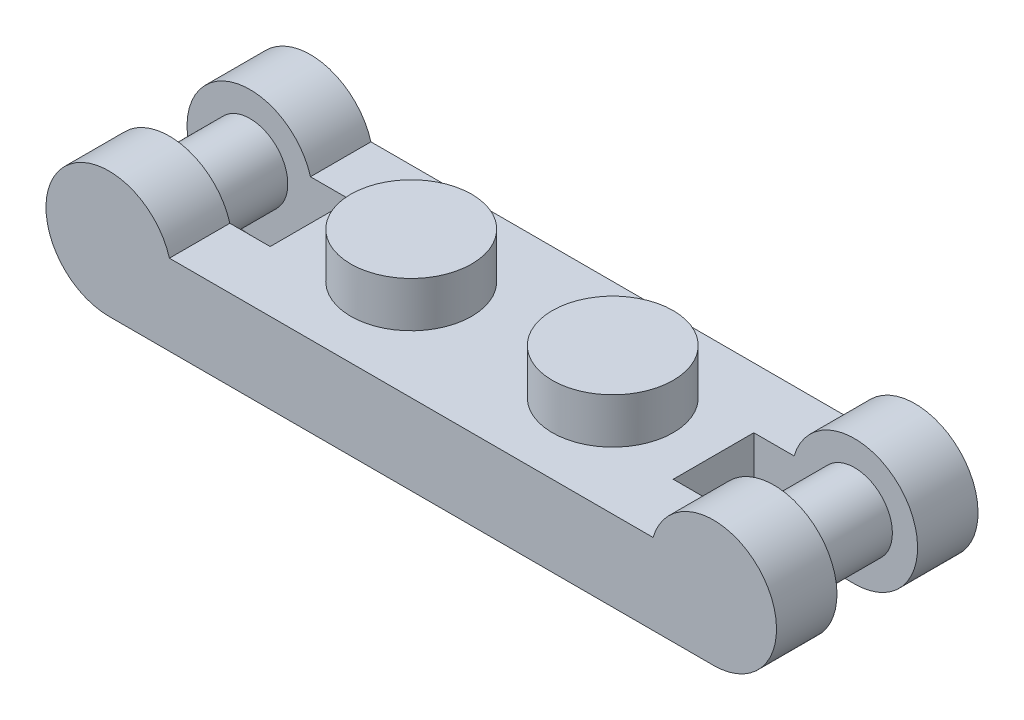
ISO-10303-21;
HEADER;
FILE_DESCRIPTION(('STEP AP214'),'2;1');
FILE_NAME('part.step','',(''),(''),'','','');
FILE_SCHEMA(('AUTOMOTIVE_DESIGN { 1 0 10303 214 1 1 1 1 }'));
ENDSEC;
DATA;
#1=APPLICATION_CONTEXT('core data for automotive mechanical design processes');
#2=APPLICATION_PROTOCOL_DEFINITION('international standard','automotive_design',2000,#1);
#3=PRODUCT_CONTEXT('',#1,'mechanical');
#4=PRODUCT('Part','Part','',(#3));
#5=PRODUCT_RELATED_PRODUCT_CATEGORY('part','',(#4));
#6=PRODUCT_DEFINITION_FORMATION('','',#4);
#7=PRODUCT_DEFINITION_CONTEXT('part definition',#1,'design');
#8=PRODUCT_DEFINITION('design','',#6,#7);
#9=PRODUCT_DEFINITION_SHAPE('','',#8);
#10=(LENGTH_UNIT() NAMED_UNIT(*) SI_UNIT(.MILLI.,.METRE.));
#11=(NAMED_UNIT(*) PLANE_ANGLE_UNIT() SI_UNIT($,.RADIAN.));
#12=(NAMED_UNIT(*) SI_UNIT($,.STERADIAN.) SOLID_ANGLE_UNIT());
#13=UNCERTAINTY_MEASURE_WITH_UNIT(LENGTH_MEASURE(1.E-05),#10,'distance_accuracy_value','');
#14=(GEOMETRIC_REPRESENTATION_CONTEXT(3) GLOBAL_UNCERTAINTY_ASSIGNED_CONTEXT((#13)) GLOBAL_UNIT_ASSIGNED_CONTEXT((#10,
#11,#12)) REPRESENTATION_CONTEXT('',''));
#15=CARTESIAN_POINT('',(0.,0.,0.));
#16=DIRECTION('',(0.,0.,1.));
#17=DIRECTION('',(1.,0.,0.));
#18=AXIS2_PLACEMENT_3D('',#15,#16,#17);
#19=CARTESIAN_POINT('',(12.,2.5,2.4));
#20=DIRECTION('',(0.,0.,1.));
#21=DIRECTION('',(1.,0.,0.));
#22=AXIS2_PLACEMENT_3D('',#19,#20,#21);
#23=PLANE('',#22);
#24=CARTESIAN_POINT('',(12.,2.5,2.4));
#25=DIRECTION('',(0.,0.,1.));
#26=DIRECTION('',(1.,0.,0.));
#27=AXIS2_PLACEMENT_3D('',#24,#25,#26);
#28=CIRCLE('',#27,1.5);
#29=CARTESIAN_POINT('',(13.5,2.5,2.4));
#30=VERTEX_POINT('',#29);
#31=EDGE_CURVE('E335',#30,#30,#28,.T.);
#32=ORIENTED_EDGE('',*,*,#31,.F.);
#33=EDGE_LOOP('',(#32));
#34=FACE_BOUND('',#33,.T.);
#35=DIRECTION('',(-1.,0.,0.));
#36=VECTOR('',#35,1.);
#37=CARTESIAN_POINT('',(9.6,3.2,2.4));
#38=LINE('',#37,#36);
#39=CARTESIAN_POINT('',(9.6,3.2,2.4));
#40=VERTEX_POINT('',#39);
#41=CARTESIAN_POINT('',(8.,3.2,2.4));
#42=VERTEX_POINT('',#41);
#43=EDGE_CURVE('E344',#40,#42,#38,.T.);
#44=ORIENTED_EDGE('',*,*,#43,.T.);
#45=DIRECTION('',(0.,1.,0.));
#46=VECTOR('',#45,1.);
#47=CARTESIAN_POINT('',(8.,3.2,2.4));
#48=LINE('',#47,#46);
#49=CARTESIAN_POINT('',(8.,0.,2.4));
#50=VERTEX_POINT('',#49);
#51=EDGE_CURVE('E66',#50,#42,#48,.T.);
#52=ORIENTED_EDGE('',*,*,#51,.F.);
#53=DIRECTION('',(1.,0.,0.));
#54=VECTOR('',#53,1.);
#55=CARTESIAN_POINT('',(0.,0.,2.4));
#56=LINE('',#55,#54);
#57=CARTESIAN_POINT('',(12.,0.,2.4));
#58=VERTEX_POINT('',#57);
#59=EDGE_CURVE('E348',#50,#58,#56,.T.);
#60=ORIENTED_EDGE('',*,*,#59,.T.);
#61=CARTESIAN_POINT('',(12.,2.5,2.4));
#62=DIRECTION('',(0.,0.,1.));
#63=DIRECTION('',(1.,0.,0.));
#64=AXIS2_PLACEMENT_3D('',#61,#62,#63);
#65=CIRCLE('',#64,2.5);
#66=EDGE_CURVE('E340',#58,#40,#65,.T.);
#67=ORIENTED_EDGE('',*,*,#66,.T.);
#68=EDGE_LOOP('',(#44,#52,#60,#67));
#69=FACE_BOUND('',#68,.T.);
#70=ADVANCED_FACE('F42',(#34,#69),#23,.T.);
#71=CARTESIAN_POINT('',(12.,2.5,2.4));
#72=DIRECTION('',(0.,0.,-1.));
#73=DIRECTION('',(-1.,0.,0.));
#74=AXIS2_PLACEMENT_3D('',#71,#72,#73);
#75=CYLINDRICAL_SURFACE('',#74,2.5);
#76=CARTESIAN_POINT('',(12.,2.5,0.));
#77=DIRECTION('',(0.,0.,1.));
#78=DIRECTION('',(1.,0.,0.));
#79=AXIS2_PLACEMENT_3D('',#76,#77,#78);
#80=CIRCLE('',#79,2.5);
#81=CARTESIAN_POINT('',(12.,0.,0.));
#82=VERTEX_POINT('',#81);
#83=CARTESIAN_POINT('',(9.6,3.2,0.));
#84=VERTEX_POINT('',#83);
#85=EDGE_CURVE('E334',#82,#84,#80,.T.);
#86=ORIENTED_EDGE('',*,*,#85,.T.);
#87=DIRECTION('',(0.,0.,-1.));
#88=VECTOR('',#87,1.);
#89=CARTESIAN_POINT('',(9.6,3.2,2.4));
#90=LINE('',#89,#88);
#91=EDGE_CURVE('E339',#40,#84,#90,.T.);
#92=ORIENTED_EDGE('',*,*,#91,.F.);
#93=ORIENTED_EDGE('',*,*,#66,.F.);
#94=DIRECTION('',(0.,0.,-1.));
#95=VECTOR('',#94,1.);
#96=CARTESIAN_POINT('',(12.,0.,2.4));
#97=LINE('',#96,#95);
#98=EDGE_CURVE('E351',#58,#82,#97,.T.);
#99=ORIENTED_EDGE('',*,*,#98,.T.);
#100=EDGE_LOOP('',(#86,#92,#93,#99));
#101=FACE_BOUND('',#100,.T.);
#102=ADVANCED_FACE('F44',(#101),#75,.T.);
#103=CARTESIAN_POINT('',(9.6,3.2,2.4));
#104=DIRECTION('',(0.,-1.,0.));
#105=DIRECTION('',(1.,0.,0.));
#106=AXIS2_PLACEMENT_3D('',#103,#104,#105);
#107=PLANE('',#106);
#108=CARTESIAN_POINT('',(4.,3.2,4.));
#109=DIRECTION('',(0.,-1.,0.));
#110=DIRECTION('',(1.,0.,0.));
#111=AXIS2_PLACEMENT_3D('',#108,#109,#110);
#112=CIRCLE('',#111,2.4);
#113=CARTESIAN_POINT('',(6.4,3.2,4.));
#114=VERTEX_POINT('',#113);
#115=EDGE_CURVE('E11',#114,#114,#112,.F.);
#116=ORIENTED_EDGE('',*,*,#115,.F.);
#117=EDGE_LOOP('',(#116));
#118=FACE_BOUND('',#117,.T.);
#119=CARTESIAN_POINT('',(-4.,3.2,4.));
#120=DIRECTION('',(0.,-1.,0.));
#121=DIRECTION('',(1.,0.,0.));
#122=AXIS2_PLACEMENT_3D('',#119,#120,#121);
#123=CIRCLE('',#122,2.4);
#124=CARTESIAN_POINT('',(-1.6,3.2,4.));
#125=VERTEX_POINT('',#124);
#126=EDGE_CURVE('E51',#125,#125,#123,.F.);
#127=ORIENTED_EDGE('',*,*,#126,.F.);
#128=EDGE_LOOP('',(#127));
#129=FACE_BOUND('',#128,.T.);
#130=DIRECTION('',(-1.,0.,0.));
#131=VECTOR('',#130,1.);
#132=CARTESIAN_POINT('',(9.6,3.2,0.));
#133=LINE('',#132,#131);
#134=CARTESIAN_POINT('',(-9.6,3.2,0.));
#135=VERTEX_POINT('',#134);
#136=EDGE_CURVE('E355',#84,#135,#133,.T.);
#137=ORIENTED_EDGE('',*,*,#136,.T.);
#138=DIRECTION('',(0.,0.,-1.));
#139=VECTOR('',#138,1.);
#140=CARTESIAN_POINT('',(-9.6,3.2,2.4));
#141=LINE('',#140,#139);
#142=CARTESIAN_POINT('',(-9.6,3.2,2.4));
#143=VERTEX_POINT('',#142);
#144=EDGE_CURVE('E264',#143,#135,#141,.T.);
#145=ORIENTED_EDGE('',*,*,#144,.F.);
#146=DIRECTION('',(1.,0.,0.));
#147=VECTOR('',#146,1.);
#148=CARTESIAN_POINT('',(-9.6,3.2,2.4));
#149=LINE('',#148,#147);
#150=CARTESIAN_POINT('',(-8.,3.2,2.4));
#151=VERTEX_POINT('',#150);
#152=EDGE_CURVE('E269',#143,#151,#149,.T.);
#153=ORIENTED_EDGE('',*,*,#152,.T.);
#154=DIRECTION('',(0.,0.,-1.));
#155=VECTOR('',#154,1.);
#156=CARTESIAN_POINT('',(-8.,3.2,4.));
#157=LINE('',#156,#155);
#158=CARTESIAN_POINT('',(-8.,3.2,5.6));
#159=VERTEX_POINT('',#158);
#160=EDGE_CURVE('E252',#159,#151,#157,.T.);
#161=ORIENTED_EDGE('',*,*,#160,.F.);
#162=DIRECTION('',(1.,0.,0.));
#163=VECTOR('',#162,1.);
#164=CARTESIAN_POINT('',(-9.6,3.2,5.6));
#165=LINE('',#164,#163);
#166=CARTESIAN_POINT('',(-9.6,3.2,5.6));
#167=VERTEX_POINT('',#166);
#168=EDGE_CURVE('E231',#167,#159,#165,.T.);
#169=ORIENTED_EDGE('',*,*,#168,.F.);
#170=DIRECTION('',(0.,0.,1.));
#171=VECTOR('',#170,1.);
#172=CARTESIAN_POINT('',(-9.6,3.2,5.6));
#173=LINE('',#172,#171);
#174=CARTESIAN_POINT('',(-9.6,3.2,8.));
#175=VERTEX_POINT('',#174);
#176=EDGE_CURVE('E227',#167,#175,#173,.T.);
#177=ORIENTED_EDGE('',*,*,#176,.T.);
#178=DIRECTION('',(-1.,0.,0.));
#179=VECTOR('',#178,1.);
#180=CARTESIAN_POINT('',(9.6,3.2,8.));
#181=LINE('',#180,#179);
#182=CARTESIAN_POINT('',(9.6,3.2,8.));
#183=VERTEX_POINT('',#182);
#184=EDGE_CURVE('E313',#183,#175,#181,.T.);
#185=ORIENTED_EDGE('',*,*,#184,.F.);
#186=DIRECTION('',(0.,0.,1.));
#187=VECTOR('',#186,1.);
#188=CARTESIAN_POINT('',(9.6,3.2,5.6));
#189=LINE('',#188,#187);
#190=CARTESIAN_POINT('',(9.6,3.2,5.6));
#191=VERTEX_POINT('',#190);
#192=EDGE_CURVE('E295',#191,#183,#189,.T.);
#193=ORIENTED_EDGE('',*,*,#192,.F.);
#194=DIRECTION('',(-1.,0.,0.));
#195=VECTOR('',#194,1.);
#196=CARTESIAN_POINT('',(9.6,3.2,5.6));
#197=LINE('',#196,#195);
#198=CARTESIAN_POINT('',(8.,3.2,5.6));
#199=VERTEX_POINT('',#198);
#200=EDGE_CURVE('E300',#191,#199,#197,.T.);
#201=ORIENTED_EDGE('',*,*,#200,.T.);
#202=DIRECTION('',(0.,0.,-1.));
#203=VECTOR('',#202,1.);
#204=CARTESIAN_POINT('',(8.,3.2,4.));
#205=LINE('',#204,#203);
#206=EDGE_CURVE('E326',#199,#42,#205,.T.);
#207=ORIENTED_EDGE('',*,*,#206,.T.);
#208=ORIENTED_EDGE('',*,*,#43,.F.);
#209=ORIENTED_EDGE('',*,*,#91,.T.);
#210=EDGE_LOOP('',(#137,#145,#153,#161,#169,#177,#185,#193,#201,#207,#208,#209));
#211=FACE_BOUND('',#210,.T.);
#212=ADVANCED_FACE('F371',(#118,#129,#211),#107,.F.);
#213=CARTESIAN_POINT('',(0.,0.,2.4));
#214=DIRECTION('',(0.,1.,0.));
#215=DIRECTION('',(0.,0.,1.));
#216=AXIS2_PLACEMENT_3D('',#213,#214,#215);
#217=PLANE('',#216);
#218=DIRECTION('',(1.,0.,0.));
#219=VECTOR('',#218,1.);
#220=CARTESIAN_POINT('',(-6.4,0.,1.6));
#221=LINE('',#220,#219);
#222=CARTESIAN_POINT('',(-6.4,0.,1.6));
#223=VERTEX_POINT('',#222);
#224=CARTESIAN_POINT('',(6.4,0.,1.6));
#225=VERTEX_POINT('',#224);
#226=EDGE_CURVE('E195',#223,#225,#221,.T.);
#227=ORIENTED_EDGE('',*,*,#226,.F.);
#228=DIRECTION('',(0.,0.,-1.));
#229=VECTOR('',#228,1.);
#230=CARTESIAN_POINT('',(-6.4,0.,6.4));
#231=LINE('',#230,#229);
#232=CARTESIAN_POINT('',(-6.4,0.,6.4));
#233=VERTEX_POINT('',#232);
#234=EDGE_CURVE('E58',#233,#223,#231,.T.);
#235=ORIENTED_EDGE('',*,*,#234,.F.);
#236=DIRECTION('',(-1.,0.,0.));
#237=VECTOR('',#236,1.);
#238=CARTESIAN_POINT('',(-6.4,0.,6.4));
#239=LINE('',#238,#237);
#240=CARTESIAN_POINT('',(6.4,0.,6.4));
#241=VERTEX_POINT('',#240);
#242=EDGE_CURVE('E179',#241,#233,#239,.T.);
#243=ORIENTED_EDGE('',*,*,#242,.F.);
#244=DIRECTION('',(0.,0.,1.));
#245=VECTOR('',#244,1.);
#246=CARTESIAN_POINT('',(6.4,0.,6.4));
#247=LINE('',#246,#245);
#248=EDGE_CURVE('E183',#225,#241,#247,.T.);
#249=ORIENTED_EDGE('',*,*,#248,.F.);
#250=EDGE_LOOP('',(#227,#235,#243,#249));
#251=FACE_BOUND('',#250,.T.);
#252=DIRECTION('',(1.,0.,0.));
#253=VECTOR('',#252,1.);
#254=CARTESIAN_POINT('',(0.,0.,0.));
#255=LINE('',#254,#253);
#256=CARTESIAN_POINT('',(-12.,0.,0.));
#257=VERTEX_POINT('',#256);
#258=EDGE_CURVE('E345',#257,#82,#255,.T.);
#259=ORIENTED_EDGE('',*,*,#258,.T.);
#260=ORIENTED_EDGE('',*,*,#98,.F.);
#261=ORIENTED_EDGE('',*,*,#59,.F.);
#262=DIRECTION('',(0.,0.,-1.));
#263=VECTOR('',#262,1.);
#264=CARTESIAN_POINT('',(8.,0.,4.));
#265=LINE('',#264,#263);
#266=CARTESIAN_POINT('',(8.,0.,5.6));
#267=VERTEX_POINT('',#266);
#268=EDGE_CURVE('E330',#267,#50,#265,.T.);
#269=ORIENTED_EDGE('',*,*,#268,.F.);
#270=DIRECTION('',(1.,0.,0.));
#271=VECTOR('',#270,1.);
#272=CARTESIAN_POINT('',(0.,0.,5.6));
#273=LINE('',#272,#271);
#274=CARTESIAN_POINT('',(12.,0.,5.6));
#275=VERTEX_POINT('',#274);
#276=EDGE_CURVE('E305',#267,#275,#273,.T.);
#277=ORIENTED_EDGE('',*,*,#276,.T.);
#278=DIRECTION('',(0.,0.,1.));
#279=VECTOR('',#278,1.);
#280=CARTESIAN_POINT('',(12.,0.,5.6));
#281=LINE('',#280,#279);
#282=CARTESIAN_POINT('',(12.,0.,8.));
#283=VERTEX_POINT('',#282);
#284=EDGE_CURVE('E309',#275,#283,#281,.T.);
#285=ORIENTED_EDGE('',*,*,#284,.T.);
#286=DIRECTION('',(1.,0.,0.));
#287=VECTOR('',#286,1.);
#288=CARTESIAN_POINT('',(0.,0.,8.));
#289=LINE('',#288,#287);
#290=CARTESIAN_POINT('',(-12.,0.,8.));
#291=VERTEX_POINT('',#290);
#292=EDGE_CURVE('E301',#291,#283,#289,.T.);
#293=ORIENTED_EDGE('',*,*,#292,.F.);
#294=DIRECTION('',(0.,0.,1.));
#295=VECTOR('',#294,1.);
#296=CARTESIAN_POINT('',(-12.,0.,5.6));
#297=LINE('',#296,#295);
#298=CARTESIAN_POINT('',(-12.,0.,5.6));
#299=VERTEX_POINT('',#298);
#300=EDGE_CURVE('E239',#299,#291,#297,.T.);
#301=ORIENTED_EDGE('',*,*,#300,.F.);
#302=DIRECTION('',(-1.,0.,0.));
#303=VECTOR('',#302,1.);
#304=CARTESIAN_POINT('',(0.,0.,5.6));
#305=LINE('',#304,#303);
#306=CARTESIAN_POINT('',(-8.,0.,5.6));
#307=VERTEX_POINT('',#306);
#308=EDGE_CURVE('E235',#307,#299,#305,.T.);
#309=ORIENTED_EDGE('',*,*,#308,.F.);
#310=DIRECTION('',(0.,0.,-1.));
#311=VECTOR('',#310,1.);
#312=CARTESIAN_POINT('',(-8.,0.,4.));
#313=LINE('',#312,#311);
#314=CARTESIAN_POINT('',(-8.,0.,2.4));
#315=VERTEX_POINT('',#314);
#316=EDGE_CURVE('E255',#307,#315,#313,.T.);
#317=ORIENTED_EDGE('',*,*,#316,.T.);
#318=DIRECTION('',(-1.,0.,0.));
#319=VECTOR('',#318,1.);
#320=CARTESIAN_POINT('',(0.,0.,2.4));
#321=LINE('',#320,#319);
#322=CARTESIAN_POINT('',(-12.,0.,2.4));
#323=VERTEX_POINT('',#322);
#324=EDGE_CURVE('E273',#315,#323,#321,.T.);
#325=ORIENTED_EDGE('',*,*,#324,.T.);
#326=DIRECTION('',(0.,0.,-1.));
#327=VECTOR('',#326,1.);
#328=CARTESIAN_POINT('',(-12.,0.,2.4));
#329=LINE('',#328,#327);
#330=EDGE_CURVE('E277',#323,#257,#329,.T.);
#331=ORIENTED_EDGE('',*,*,#330,.T.);
#332=EDGE_LOOP('',(#259,#260,#261,#269,#277,#285,#293,#301,#309,#317,#325,#331));
#333=FACE_BOUND('',#332,.T.);
#334=ADVANCED_FACE('F374',(#251,#333),#217,.F.);
#335=CARTESIAN_POINT('',(12.,2.5,0.));
#336=DIRECTION('',(0.,0.,1.));
#337=DIRECTION('',(1.,0.,0.));
#338=AXIS2_PLACEMENT_3D('',#335,#336,#337);
#339=PLANE('',#338);
#340=ORIENTED_EDGE('',*,*,#85,.F.);
#341=ORIENTED_EDGE('',*,*,#258,.F.);
#342=CARTESIAN_POINT('',(-12.,2.5,0.));
#343=DIRECTION('',(0.,0.,-1.));
#344=DIRECTION('',(-1.,0.,0.));
#345=AXIS2_PLACEMENT_3D('',#342,#343,#344);
#346=CIRCLE('',#345,2.5);
#347=EDGE_CURVE('E258',#257,#135,#346,.T.);
#348=ORIENTED_EDGE('',*,*,#347,.T.);
#349=ORIENTED_EDGE('',*,*,#136,.F.);
#350=EDGE_LOOP('',(#340,#341,#348,#349));
#351=FACE_BOUND('',#350,.T.);
#352=ADVANCED_FACE('F384',(#351),#339,.F.);
#353=CARTESIAN_POINT('',(12.,2.5,4.));
#354=DIRECTION('',(0.,0.,-1.));
#355=DIRECTION('',(-1.,0.,0.));
#356=AXIS2_PLACEMENT_3D('',#353,#354,#355);
#357=CYLINDRICAL_SURFACE('',#356,1.5);
#358=ORIENTED_EDGE('',*,*,#31,.T.);
#359=EDGE_LOOP('',(#358));
#360=FACE_BOUND('',#359,.T.);
#361=CARTESIAN_POINT('',(12.,2.5,5.6));
#362=DIRECTION('',(0.,0.,1.));
#363=DIRECTION('',(1.,0.,0.));
#364=AXIS2_PLACEMENT_3D('',#361,#362,#363);
#365=CIRCLE('',#364,1.5);
#366=CARTESIAN_POINT('',(13.5,2.5,5.6));
#367=VERTEX_POINT('',#366);
#368=EDGE_CURVE('E291',#367,#367,#365,.T.);
#369=ORIENTED_EDGE('',*,*,#368,.F.);
#370=EDGE_LOOP('',(#369));
#371=FACE_BOUND('',#370,.T.);
#372=ADVANCED_FACE('F418',(#360,#371),#357,.T.);
#373=CARTESIAN_POINT('',(8.,3.2,4.));
#374=DIRECTION('',(-1.,0.,0.));
#375=DIRECTION('',(0.,0.,1.));
#376=AXIS2_PLACEMENT_3D('',#373,#374,#375);
#377=PLANE('',#376);
#378=ORIENTED_EDGE('',*,*,#51,.T.);
#379=ORIENTED_EDGE('',*,*,#206,.F.);
#380=DIRECTION('',(0.,1.,0.));
#381=VECTOR('',#380,1.);
#382=CARTESIAN_POINT('',(8.,3.2,5.6));
#383=LINE('',#382,#381);
#384=EDGE_CURVE('E263',#267,#199,#383,.T.);
#385=ORIENTED_EDGE('',*,*,#384,.F.);
#386=ORIENTED_EDGE('',*,*,#268,.T.);
#387=EDGE_LOOP('',(#378,#379,#385,#386));
#388=FACE_BOUND('',#387,.T.);
#389=ADVANCED_FACE('F416',(#388),#377,.F.);
#390=CARTESIAN_POINT('',(12.,2.5,5.6));
#391=DIRECTION('',(0.,0.,-1.));
#392=DIRECTION('',(1.,0.,0.));
#393=AXIS2_PLACEMENT_3D('',#390,#391,#392);
#394=PLANE('',#393);
#395=ORIENTED_EDGE('',*,*,#368,.T.);
#396=EDGE_LOOP('',(#395));
#397=FACE_BOUND('',#396,.T.);
#398=ORIENTED_EDGE('',*,*,#200,.F.);
#399=CARTESIAN_POINT('',(12.,2.5,5.6));
#400=DIRECTION('',(0.,0.,1.));
#401=DIRECTION('',(1.,0.,0.));
#402=AXIS2_PLACEMENT_3D('',#399,#400,#401);
#403=CIRCLE('',#402,2.5);
#404=EDGE_CURVE('E296',#275,#191,#403,.T.);
#405=ORIENTED_EDGE('',*,*,#404,.F.);
#406=ORIENTED_EDGE('',*,*,#276,.F.);
#407=ORIENTED_EDGE('',*,*,#384,.T.);
#408=EDGE_LOOP('',(#398,#405,#406,#407));
#409=FACE_BOUND('',#408,.T.);
#410=ADVANCED_FACE('F414',(#397,#409),#394,.T.);
#411=CARTESIAN_POINT('',(12.,2.5,5.6));
#412=DIRECTION('',(0.,0.,1.));
#413=DIRECTION('',(-1.,0.,0.));
#414=AXIS2_PLACEMENT_3D('',#411,#412,#413);
#415=CYLINDRICAL_SURFACE('',#414,2.5);
#416=CARTESIAN_POINT('',(12.,2.5,8.));
#417=DIRECTION('',(0.,0.,1.));
#418=DIRECTION('',(1.,0.,0.));
#419=AXIS2_PLACEMENT_3D('',#416,#417,#418);
#420=CIRCLE('',#419,2.5);
#421=EDGE_CURVE('E290',#283,#183,#420,.T.);
#422=ORIENTED_EDGE('',*,*,#421,.F.);
#423=ORIENTED_EDGE('',*,*,#284,.F.);
#424=ORIENTED_EDGE('',*,*,#404,.T.);
#425=ORIENTED_EDGE('',*,*,#192,.T.);
#426=EDGE_LOOP('',(#422,#423,#424,#425));
#427=FACE_BOUND('',#426,.T.);
#428=ADVANCED_FACE('F407',(#427),#415,.T.);
#429=CARTESIAN_POINT('',(12.,2.5,8.));
#430=DIRECTION('',(0.,0.,-1.));
#431=DIRECTION('',(1.,0.,0.));
#432=AXIS2_PLACEMENT_3D('',#429,#430,#431);
#433=PLANE('',#432);
#434=ORIENTED_EDGE('',*,*,#421,.T.);
#435=ORIENTED_EDGE('',*,*,#184,.T.);
#436=CARTESIAN_POINT('',(-12.,2.5,8.));
#437=DIRECTION('',(0.,0.,-1.));
#438=DIRECTION('',(-1.,0.,0.));
#439=AXIS2_PLACEMENT_3D('',#436,#437,#438);
#440=CIRCLE('',#439,2.5);
#441=EDGE_CURVE('E221',#291,#175,#440,.T.);
#442=ORIENTED_EDGE('',*,*,#441,.F.);
#443=ORIENTED_EDGE('',*,*,#292,.T.);
#444=EDGE_LOOP('',(#434,#435,#442,#443));
#445=FACE_BOUND('',#444,.T.);
#446=ADVANCED_FACE('F410',(#445),#433,.F.);
#447=CARTESIAN_POINT('',(-12.,2.5,2.4));
#448=DIRECTION('',(0.,0.,1.));
#449=DIRECTION('',(-1.,0.,0.));
#450=AXIS2_PLACEMENT_3D('',#447,#448,#449);
#451=PLANE('',#450);
#452=CARTESIAN_POINT('',(-12.,2.5,2.4));
#453=DIRECTION('',(0.,0.,-1.));
#454=DIRECTION('',(-1.,0.,0.));
#455=AXIS2_PLACEMENT_3D('',#452,#453,#454);
#456=CIRCLE('',#455,1.5);
#457=CARTESIAN_POINT('',(-13.5,2.5,2.4));
#458=VERTEX_POINT('',#457);
#459=EDGE_CURVE('E259',#458,#458,#456,.T.);
#460=ORIENTED_EDGE('',*,*,#459,.T.);
#461=EDGE_LOOP('',(#460));
#462=FACE_BOUND('',#461,.T.);
#463=ORIENTED_EDGE('',*,*,#152,.F.);
#464=CARTESIAN_POINT('',(-12.,2.5,2.4));
#465=DIRECTION('',(0.,0.,-1.));
#466=DIRECTION('',(-1.,0.,0.));
#467=AXIS2_PLACEMENT_3D('',#464,#465,#466);
#468=CIRCLE('',#467,2.5);
#469=EDGE_CURVE('E265',#323,#143,#468,.T.);
#470=ORIENTED_EDGE('',*,*,#469,.F.);
#471=ORIENTED_EDGE('',*,*,#324,.F.);
#472=DIRECTION('',(0.,1.,0.));
#473=VECTOR('',#472,1.);
#474=CARTESIAN_POINT('',(-8.,3.2,2.4));
#475=LINE('',#474,#473);
#476=EDGE_CURVE('E226',#315,#151,#475,.T.);
#477=ORIENTED_EDGE('',*,*,#476,.T.);
#478=EDGE_LOOP('',(#463,#470,#471,#477));
#479=FACE_BOUND('',#478,.T.);
#480=ADVANCED_FACE('F392',(#462,#479),#451,.T.);
#481=CARTESIAN_POINT('',(-12.,2.5,2.4));
#482=DIRECTION('',(0.,0.,-1.));
#483=DIRECTION('',(1.,0.,0.));
#484=AXIS2_PLACEMENT_3D('',#481,#482,#483);
#485=CYLINDRICAL_SURFACE('',#484,2.5);
#486=ORIENTED_EDGE('',*,*,#347,.F.);
#487=ORIENTED_EDGE('',*,*,#330,.F.);
#488=ORIENTED_EDGE('',*,*,#469,.T.);
#489=ORIENTED_EDGE('',*,*,#144,.T.);
#490=EDGE_LOOP('',(#486,#487,#488,#489));
#491=FACE_BOUND('',#490,.T.);
#492=ADVANCED_FACE('F381',(#491),#485,.T.);
#493=CARTESIAN_POINT('',(-12.,2.5,4.));
#494=DIRECTION('',(0.,0.,-1.));
#495=DIRECTION('',(1.,0.,0.));
#496=AXIS2_PLACEMENT_3D('',#493,#494,#495);
#497=CYLINDRICAL_SURFACE('',#496,1.5);
#498=ORIENTED_EDGE('',*,*,#459,.F.);
#499=EDGE_LOOP('',(#498));
#500=FACE_BOUND('',#499,.T.);
#501=CARTESIAN_POINT('',(-12.,2.5,5.6));
#502=DIRECTION('',(0.,0.,-1.));
#503=DIRECTION('',(-1.,0.,0.));
#504=AXIS2_PLACEMENT_3D('',#501,#502,#503);
#505=CIRCLE('',#504,1.5);
#506=CARTESIAN_POINT('',(-13.5,2.5,5.6));
#507=VERTEX_POINT('',#506);
#508=EDGE_CURVE('E222',#507,#507,#505,.T.);
#509=ORIENTED_EDGE('',*,*,#508,.T.);
#510=EDGE_LOOP('',(#509));
#511=FACE_BOUND('',#510,.T.);
#512=ADVANCED_FACE('F485',(#500,#511),#497,.T.);
#513=CARTESIAN_POINT('',(-8.,3.2,4.));
#514=DIRECTION('',(1.,0.,0.));
#515=DIRECTION('',(0.,0.,1.));
#516=AXIS2_PLACEMENT_3D('',#513,#514,#515);
#517=PLANE('',#516);
#518=ORIENTED_EDGE('',*,*,#476,.F.);
#519=ORIENTED_EDGE('',*,*,#316,.F.);
#520=DIRECTION('',(0.,1.,0.));
#521=VECTOR('',#520,1.);
#522=CARTESIAN_POINT('',(-8.,3.2,5.6));
#523=LINE('',#522,#521);
#524=EDGE_CURVE('E218',#307,#159,#523,.T.);
#525=ORIENTED_EDGE('',*,*,#524,.T.);
#526=ORIENTED_EDGE('',*,*,#160,.T.);
#527=EDGE_LOOP('',(#518,#519,#525,#526));
#528=FACE_BOUND('',#527,.T.);
#529=ADVANCED_FACE('F396',(#528),#517,.F.);
#530=CARTESIAN_POINT('',(-12.,2.5,5.6));
#531=DIRECTION('',(0.,0.,-1.));
#532=DIRECTION('',(-1.,0.,0.));
#533=AXIS2_PLACEMENT_3D('',#530,#531,#532);
#534=PLANE('',#533);
#535=ORIENTED_EDGE('',*,*,#508,.F.);
#536=EDGE_LOOP('',(#535));
#537=FACE_BOUND('',#536,.T.);
#538=ORIENTED_EDGE('',*,*,#168,.T.);
#539=ORIENTED_EDGE('',*,*,#524,.F.);
#540=ORIENTED_EDGE('',*,*,#308,.T.);
#541=CARTESIAN_POINT('',(-12.,2.5,5.6));
#542=DIRECTION('',(0.,0.,-1.));
#543=DIRECTION('',(-1.,0.,0.));
#544=AXIS2_PLACEMENT_3D('',#541,#542,#543);
#545=CIRCLE('',#544,2.5);
#546=EDGE_CURVE('E228',#299,#167,#545,.T.);
#547=ORIENTED_EDGE('',*,*,#546,.T.);
#548=EDGE_LOOP('',(#538,#539,#540,#547));
#549=FACE_BOUND('',#548,.T.);
#550=ADVANCED_FACE('F398',(#537,#549),#534,.T.);
#551=CARTESIAN_POINT('',(-12.,2.5,5.6));
#552=DIRECTION('',(0.,0.,1.));
#553=DIRECTION('',(1.,0.,0.));
#554=AXIS2_PLACEMENT_3D('',#551,#552,#553);
#555=CYLINDRICAL_SURFACE('',#554,2.5);
#556=ORIENTED_EDGE('',*,*,#441,.T.);
#557=ORIENTED_EDGE('',*,*,#176,.F.);
#558=ORIENTED_EDGE('',*,*,#546,.F.);
#559=ORIENTED_EDGE('',*,*,#300,.T.);
#560=EDGE_LOOP('',(#556,#557,#558,#559));
#561=FACE_BOUND('',#560,.T.);
#562=ADVANCED_FACE('F402',(#561),#555,.T.);
#563=CARTESIAN_POINT('',(-4.,5.,4.));
#564=DIRECTION('',(0.,-1.,0.));
#565=DIRECTION('',(1.,0.,0.));
#566=AXIS2_PLACEMENT_3D('',#563,#564,#565);
#567=CYLINDRICAL_SURFACE('',#566,2.4);
#568=CARTESIAN_POINT('',(-4.,5.,4.));
#569=DIRECTION('',(0.,1.,0.));
#570=DIRECTION('',(-1.,0.,0.));
#571=AXIS2_PLACEMENT_3D('',#568,#569,#570);
#572=CIRCLE('',#571,2.4);
#573=CARTESIAN_POINT('',(-6.4,5.,4.));
#574=VERTEX_POINT('',#573);
#575=EDGE_CURVE('E214',#574,#574,#572,.T.);
#576=ORIENTED_EDGE('',*,*,#575,.F.);
#577=EDGE_LOOP('',(#576));
#578=FACE_BOUND('',#577,.T.);
#579=ORIENTED_EDGE('',*,*,#126,.T.);
#580=EDGE_LOOP('',(#579));
#581=FACE_BOUND('',#580,.T.);
#582=ADVANCED_FACE('F369',(#578,#581),#567,.T.);
#583=CARTESIAN_POINT('',(-4.,5.,4.));
#584=DIRECTION('',(0.,1.,0.));
#585=DIRECTION('',(-1.,0.,0.));
#586=AXIS2_PLACEMENT_3D('',#583,#584,#585);
#587=PLANE('',#586);
#588=ORIENTED_EDGE('',*,*,#575,.T.);
#589=EDGE_LOOP('',(#588));
#590=FACE_BOUND('',#589,.T.);
#591=ADVANCED_FACE('F467',(#590),#587,.T.);
#592=CARTESIAN_POINT('',(4.,5.,4.));
#593=DIRECTION('',(0.,-1.,0.));
#594=DIRECTION('',(1.,0.,0.));
#595=AXIS2_PLACEMENT_3D('',#592,#593,#594);
#596=CYLINDRICAL_SURFACE('',#595,2.4);
#597=CARTESIAN_POINT('',(4.,5.,4.));
#598=DIRECTION('',(0.,1.,0.));
#599=DIRECTION('',(-1.,0.,0.));
#600=AXIS2_PLACEMENT_3D('',#597,#598,#599);
#601=CIRCLE('',#600,2.4);
#602=CARTESIAN_POINT('',(1.6,5.,4.));
#603=VERTEX_POINT('',#602);
#604=EDGE_CURVE('E205',#603,#603,#601,.T.);
#605=ORIENTED_EDGE('',*,*,#604,.F.);
#606=EDGE_LOOP('',(#605));
#607=FACE_BOUND('',#606,.T.);
#608=ORIENTED_EDGE('',*,*,#115,.T.);
#609=EDGE_LOOP('',(#608));
#610=FACE_BOUND('',#609,.T.);
#611=ADVANCED_FACE('F464',(#607,#610),#596,.T.);
#612=CARTESIAN_POINT('',(4.,5.,4.));
#613=DIRECTION('',(0.,1.,0.));
#614=DIRECTION('',(-1.,0.,0.));
#615=AXIS2_PLACEMENT_3D('',#612,#613,#614);
#616=PLANE('',#615);
#617=ORIENTED_EDGE('',*,*,#604,.T.);
#618=EDGE_LOOP('',(#617));
#619=FACE_BOUND('',#618,.T.);
#620=ADVANCED_FACE('F457',(#619),#616,.T.);
#621=CARTESIAN_POINT('',(-6.4,1.8,6.4));
#622=DIRECTION('',(-1.,0.,0.));
#623=DIRECTION('',(0.,0.,1.));
#624=AXIS2_PLACEMENT_3D('',#621,#622,#623);
#625=PLANE('',#624);
#626=ORIENTED_EDGE('',*,*,#234,.T.);
#627=DIRECTION('',(0.,-1.,0.));
#628=VECTOR('',#627,1.);
#629=CARTESIAN_POINT('',(-6.4,1.8,1.6));
#630=LINE('',#629,#628);
#631=CARTESIAN_POINT('',(-6.4,1.8,1.6));
#632=VERTEX_POINT('',#631);
#633=EDGE_CURVE('E154',#632,#223,#630,.T.);
#634=ORIENTED_EDGE('',*,*,#633,.F.);
#635=DIRECTION('',(0.,0.,-1.));
#636=VECTOR('',#635,1.);
#637=CARTESIAN_POINT('',(-6.4,1.8,6.4));
#638=LINE('',#637,#636);
#639=CARTESIAN_POINT('',(-6.4,1.8,6.4));
#640=VERTEX_POINT('',#639);
#641=EDGE_CURVE('E158',#640,#632,#638,.T.);
#642=ORIENTED_EDGE('',*,*,#641,.F.);
#643=DIRECTION('',(0.,-1.,0.));
#644=VECTOR('',#643,1.);
#645=CARTESIAN_POINT('',(-6.4,1.8,6.4));
#646=LINE('',#645,#644);
#647=EDGE_CURVE('E202',#640,#233,#646,.T.);
#648=ORIENTED_EDGE('',*,*,#647,.T.);
#649=EDGE_LOOP('',(#626,#634,#642,#648));
#650=FACE_BOUND('',#649,.T.);
#651=ADVANCED_FACE('F156',(#650),#625,.F.);
#652=CARTESIAN_POINT('',(-6.4,1.8,6.4));
#653=DIRECTION('',(0.,0.,1.));
#654=DIRECTION('',(1.,0.,0.));
#655=AXIS2_PLACEMENT_3D('',#652,#653,#654);
#656=PLANE('',#655);
#657=ORIENTED_EDGE('',*,*,#242,.T.);
#658=ORIENTED_EDGE('',*,*,#647,.F.);
#659=DIRECTION('',(-1.,0.,0.));
#660=VECTOR('',#659,1.);
#661=CARTESIAN_POINT('',(-6.4,1.8,6.4));
#662=LINE('',#661,#660);
#663=CARTESIAN_POINT('',(6.4,1.8,6.4));
#664=VERTEX_POINT('',#663);
#665=EDGE_CURVE('E165',#664,#640,#662,.T.);
#666=ORIENTED_EDGE('',*,*,#665,.F.);
#667=DIRECTION('',(0.,-1.,0.));
#668=VECTOR('',#667,1.);
#669=CARTESIAN_POINT('',(6.4,1.8,6.4));
#670=LINE('',#669,#668);
#671=EDGE_CURVE('E206',#664,#241,#670,.T.);
#672=ORIENTED_EDGE('',*,*,#671,.T.);
#673=EDGE_LOOP('',(#657,#658,#666,#672));
#674=FACE_BOUND('',#673,.T.);
#675=ADVANCED_FACE('F449',(#674),#656,.F.);
#676=CARTESIAN_POINT('',(6.4,1.8,6.4));
#677=DIRECTION('',(1.,0.,0.));
#678=DIRECTION('',(0.,0.,-1.));
#679=AXIS2_PLACEMENT_3D('',#676,#677,#678);
#680=PLANE('',#679);
#681=ORIENTED_EDGE('',*,*,#248,.T.);
#682=ORIENTED_EDGE('',*,*,#671,.F.);
#683=DIRECTION('',(0.,0.,1.));
#684=VECTOR('',#683,1.);
#685=CARTESIAN_POINT('',(6.4,1.8,6.4));
#686=LINE('',#685,#684);
#687=CARTESIAN_POINT('',(6.4,1.8,1.6));
#688=VERTEX_POINT('',#687);
#689=EDGE_CURVE('E174',#688,#664,#686,.T.);
#690=ORIENTED_EDGE('',*,*,#689,.F.);
#691=DIRECTION('',(0.,-1.,0.));
#692=VECTOR('',#691,1.);
#693=CARTESIAN_POINT('',(6.4,1.8,1.6));
#694=LINE('',#693,#692);
#695=EDGE_CURVE('E164',#688,#225,#694,.T.);
#696=ORIENTED_EDGE('',*,*,#695,.T.);
#697=EDGE_LOOP('',(#681,#682,#690,#696));
#698=FACE_BOUND('',#697,.T.);
#699=ADVANCED_FACE('F447',(#698),#680,.F.);
#700=CARTESIAN_POINT('',(-6.4,1.8,1.6));
#701=DIRECTION('',(0.,0.,-1.));
#702=DIRECTION('',(-1.,0.,0.));
#703=AXIS2_PLACEMENT_3D('',#700,#701,#702);
#704=PLANE('',#703);
#705=ORIENTED_EDGE('',*,*,#226,.T.);
#706=ORIENTED_EDGE('',*,*,#695,.F.);
#707=DIRECTION('',(1.,0.,0.));
#708=VECTOR('',#707,1.);
#709=CARTESIAN_POINT('',(-6.4,1.8,1.6));
#710=LINE('',#709,#708);
#711=EDGE_CURVE('E168',#632,#688,#710,.T.);
#712=ORIENTED_EDGE('',*,*,#711,.F.);
#713=ORIENTED_EDGE('',*,*,#633,.T.);
#714=EDGE_LOOP('',(#705,#706,#712,#713));
#715=FACE_BOUND('',#714,.T.);
#716=ADVANCED_FACE('F169',(#715),#704,.F.);
#717=CARTESIAN_POINT('',(0.,1.8,0.));
#718=DIRECTION('',(0.,-1.,0.));
#719=DIRECTION('',(0.,0.,-1.));
#720=AXIS2_PLACEMENT_3D('',#717,#718,#719);
#721=PLANE('',#720);
#722=CARTESIAN_POINT('',(0.,1.8,4.));
#723=DIRECTION('',(0.,-1.,0.));
#724=DIRECTION('',(0.,0.,-1.));
#725=AXIS2_PLACEMENT_3D('',#722,#723,#724);
#726=CIRCLE('',#725,1.6);
#727=CARTESIAN_POINT('',(0.,1.8,2.4));
#728=VERTEX_POINT('',#727);
#729=EDGE_CURVE('E186',#728,#728,#726,.T.);
#730=ORIENTED_EDGE('',*,*,#729,.F.);
#731=EDGE_LOOP('',(#730));
#732=FACE_BOUND('',#731,.T.);
#733=ORIENTED_EDGE('',*,*,#641,.T.);
#734=ORIENTED_EDGE('',*,*,#711,.T.);
#735=ORIENTED_EDGE('',*,*,#689,.T.);
#736=ORIENTED_EDGE('',*,*,#665,.T.);
#737=EDGE_LOOP('',(#733,#734,#735,#736));
#738=FACE_BOUND('',#737,.T.);
#739=ADVANCED_FACE('F176',(#732,#738),#721,.T.);
#740=CARTESIAN_POINT('',(0.,0.,4.));
#741=DIRECTION('',(0.,1.,0.));
#742=DIRECTION('',(0.,0.,1.));
#743=AXIS2_PLACEMENT_3D('',#740,#741,#742);
#744=CYLINDRICAL_SURFACE('',#743,1.6);
#745=CARTESIAN_POINT('',(0.,0.,4.));
#746=DIRECTION('',(0.,-1.,0.));
#747=DIRECTION('',(0.,0.,-1.));
#748=AXIS2_PLACEMENT_3D('',#745,#746,#747);
#749=CIRCLE('',#748,1.6);
#750=CARTESIAN_POINT('',(0.,0.,2.4));
#751=VERTEX_POINT('',#750);
#752=EDGE_CURVE('E196',#751,#751,#749,.T.);
#753=ORIENTED_EDGE('',*,*,#752,.F.);
#754=EDGE_LOOP('',(#753));
#755=FACE_BOUND('',#754,.T.);
#756=ORIENTED_EDGE('',*,*,#729,.T.);
#757=EDGE_LOOP('',(#756));
#758=FACE_BOUND('',#757,.T.);
#759=ADVANCED_FACE('F583',(#755,#758),#744,.T.);
#760=CARTESIAN_POINT('',(0.,0.,4.));
#761=DIRECTION('',(0.,-1.,0.));
#762=DIRECTION('',(0.,0.,-1.));
#763=AXIS2_PLACEMENT_3D('',#760,#761,#762);
#764=PLANE('',#763);
#765=ORIENTED_EDGE('',*,*,#752,.T.);
#766=EDGE_LOOP('',(#765));
#767=FACE_BOUND('',#766,.T.);
#768=ADVANCED_FACE('F593',(#767),#764,.T.);
#769=CLOSED_SHELL('',(#70,#102,#212,#334,#352,#372,#389,#410,#428,#446,#480,#492,#512,#529,#550,
#562,#582,#591,#611,#620,#651,#675,#699,#716,#739,#759,#768));
#770=MANIFOLD_SOLID_BREP('B2',#769);
#771=ADVANCED_BREP_SHAPE_REPRESENTATION('',(#18,#770),#14);
#772=SHAPE_DEFINITION_REPRESENTATION(#9,#771);
ENDSEC;
END-ISO-10303-21;
